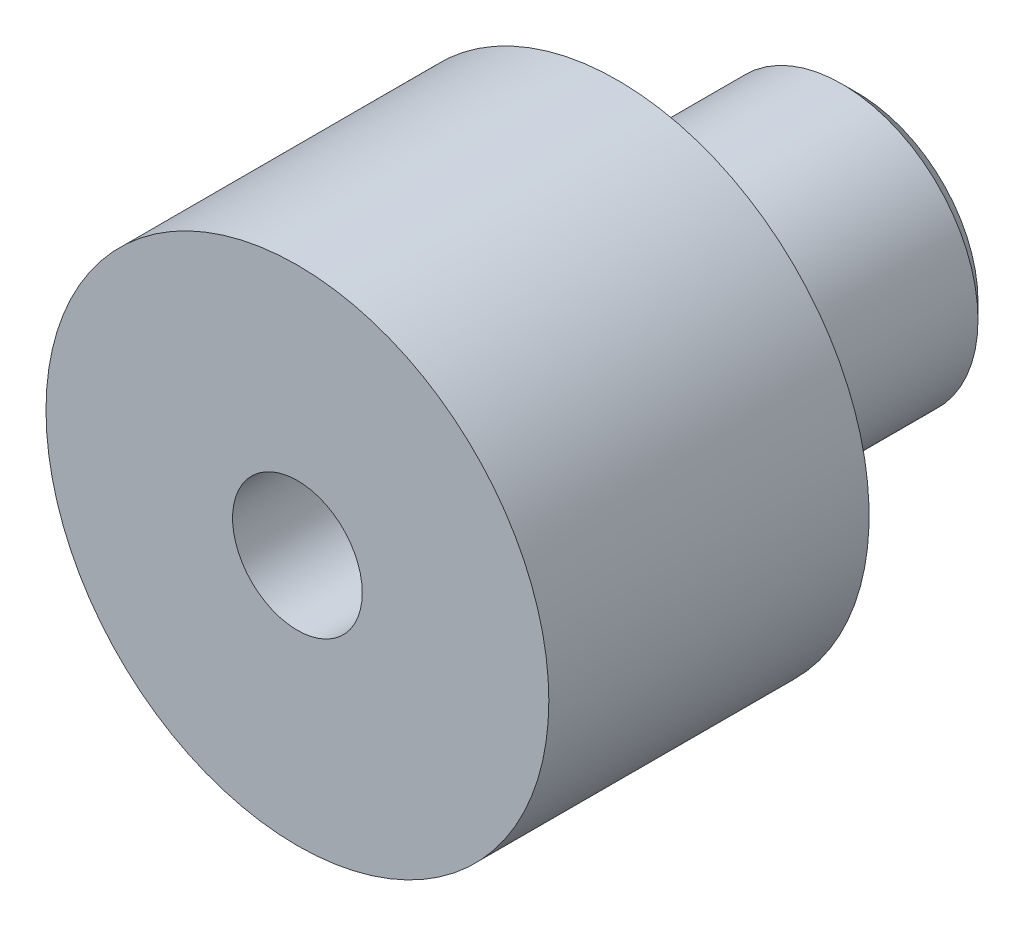
ISO-10303-21;
HEADER;
FILE_DESCRIPTION(('STEP AP214'),'2;1');
FILE_NAME('part.step','',(''),(''),'','','');
FILE_SCHEMA(('AUTOMOTIVE_DESIGN { 1 0 10303 214 1 1 1 1 }'));
ENDSEC;
DATA;
#1=APPLICATION_CONTEXT('core data for automotive mechanical design processes');
#2=APPLICATION_PROTOCOL_DEFINITION('international standard','automotive_design',2000,#1);
#3=PRODUCT_CONTEXT('',#1,'mechanical');
#4=PRODUCT('Part','Part','',(#3));
#5=PRODUCT_RELATED_PRODUCT_CATEGORY('part','',(#4));
#6=PRODUCT_DEFINITION_FORMATION('','',#4);
#7=PRODUCT_DEFINITION_CONTEXT('part definition',#1,'design');
#8=PRODUCT_DEFINITION('design','',#6,#7);
#9=PRODUCT_DEFINITION_SHAPE('','',#8);
#10=(LENGTH_UNIT() NAMED_UNIT(*) SI_UNIT(.MILLI.,.METRE.));
#11=(NAMED_UNIT(*) PLANE_ANGLE_UNIT() SI_UNIT($,.RADIAN.));
#12=(NAMED_UNIT(*) SI_UNIT($,.STERADIAN.) SOLID_ANGLE_UNIT());
#13=UNCERTAINTY_MEASURE_WITH_UNIT(LENGTH_MEASURE(1.E-05),#10,'distance_accuracy_value','');
#14=(GEOMETRIC_REPRESENTATION_CONTEXT(3) GLOBAL_UNCERTAINTY_ASSIGNED_CONTEXT((#13)) GLOBAL_UNIT_ASSIGNED_CONTEXT((#10,
#11,#12)) REPRESENTATION_CONTEXT('',''));
#15=CARTESIAN_POINT('',(0.,0.,0.));
#16=DIRECTION('',(0.,0.,1.));
#17=DIRECTION('',(1.,0.,0.));
#18=AXIS2_PLACEMENT_3D('',#15,#16,#17);
#19=CARTESIAN_POINT('',(0.,0.,30.));
#20=DIRECTION('',(0.,0.,1.));
#21=DIRECTION('',(1.,0.,0.));
#22=AXIS2_PLACEMENT_3D('',#19,#20,#21);
#23=PLANE('',#22);
#24=CARTESIAN_POINT('',(0.,0.,30.));
#25=DIRECTION('',(0.,0.,1.));
#26=DIRECTION('',(1.,0.,0.));
#27=AXIS2_PLACEMENT_3D('',#24,#25,#26);
#28=CIRCLE('',#27,9.5);
#29=CARTESIAN_POINT('',(9.5,0.,30.));
#30=VERTEX_POINT('',#29);
#31=EDGE_CURVE('E94',#30,#30,#28,.T.);
#32=ORIENTED_EDGE('',*,*,#31,.T.);
#33=EDGE_LOOP('',(#32));
#34=FACE_BOUND('',#33,.T.);
#35=CARTESIAN_POINT('',(0.,0.,30.));
#36=DIRECTION('',(0.,0.,1.));
#37=DIRECTION('',(1.,0.,0.));
#38=AXIS2_PLACEMENT_3D('',#35,#36,#37);
#39=CIRCLE('',#38,9.7);
#40=CARTESIAN_POINT('',(9.7,0.,30.));
#41=VERTEX_POINT('',#40);
#42=EDGE_CURVE('E98',#41,#41,#39,.F.);
#43=ORIENTED_EDGE('',*,*,#42,.T.);
#44=EDGE_LOOP('',(#43));
#45=FACE_BOUND('',#44,.T.);
#46=ADVANCED_FACE('F53',(#34,#45),#23,.F.);
#47=CARTESIAN_POINT('',(0.,0.,0.));
#48=DIRECTION('',(0.,0.,1.));
#49=DIRECTION('',(1.,0.,0.));
#50=AXIS2_PLACEMENT_3D('',#47,#48,#49);
#51=PLANE('',#50);
#52=CARTESIAN_POINT('',(0.,0.,0.));
#53=DIRECTION('',(0.,0.,1.));
#54=DIRECTION('',(1.,0.,0.));
#55=AXIS2_PLACEMENT_3D('',#52,#53,#54);
#56=CIRCLE('',#55,7.5);
#57=CARTESIAN_POINT('',(7.5,0.,0.));
#58=VERTEX_POINT('',#57);
#59=EDGE_CURVE('E62',#58,#58,#56,.F.);
#60=ORIENTED_EDGE('',*,*,#59,.T.);
#61=EDGE_LOOP('',(#60));
#62=FACE_BOUND('',#61,.T.);
#63=CARTESIAN_POINT('',(0.,0.,0.));
#64=DIRECTION('',(0.,0.,1.));
#65=DIRECTION('',(1.,0.,0.));
#66=AXIS2_PLACEMENT_3D('',#63,#64,#65);
#67=CIRCLE('',#66,5.05000000000001);
#68=CARTESIAN_POINT('',(5.05000000000001,0.,0.));
#69=VERTEX_POINT('',#68);
#70=EDGE_CURVE('E67',#69,#69,#67,.T.);
#71=ORIENTED_EDGE('',*,*,#70,.T.);
#72=EDGE_LOOP('',(#71));
#73=FACE_BOUND('',#72,.T.);
#74=ADVANCED_FACE('F134',(#62,#73),#51,.F.);
#75=CARTESIAN_POINT('',(0.,0.,30.));
#76=DIRECTION('',(0.,0.,-1.));
#77=DIRECTION('',(-1.,0.,0.));
#78=AXIS2_PLACEMENT_3D('',#75,#76,#77);
#79=CYLINDRICAL_SURFACE('',#78,8.5);
#80=CARTESIAN_POINT('',(0.,0.,1.));
#81=DIRECTION('',(0.,0.,1.));
#82=DIRECTION('',(1.,0.,0.));
#83=AXIS2_PLACEMENT_3D('',#80,#81,#82);
#84=CIRCLE('',#83,8.5);
#85=CARTESIAN_POINT('',(8.5,0.,1.));
#86=VERTEX_POINT('',#85);
#87=EDGE_CURVE('E72',#86,#86,#84,.T.);
#88=ORIENTED_EDGE('',*,*,#87,.T.);
#89=EDGE_LOOP('',(#88));
#90=FACE_BOUND('',#89,.T.);
#91=CARTESIAN_POINT('',(0.,0.,29.));
#92=DIRECTION('',(0.,0.,1.));
#93=DIRECTION('',(1.,0.,0.));
#94=AXIS2_PLACEMENT_3D('',#91,#92,#93);
#95=CIRCLE('',#94,8.5);
#96=CARTESIAN_POINT('',(8.5,0.,29.));
#97=VERTEX_POINT('',#96);
#98=EDGE_CURVE('E90',#97,#97,#95,.F.);
#99=ORIENTED_EDGE('',*,*,#98,.T.);
#100=EDGE_LOOP('',(#99));
#101=FACE_BOUND('',#100,.T.);
#102=ADVANCED_FACE('F129',(#90,#101),#79,.T.);
#103=CARTESIAN_POINT('',(0.,0.,30.));
#104=DIRECTION('',(0.,0.,-1.));
#105=DIRECTION('',(-1.,0.,0.));
#106=AXIS2_PLACEMENT_3D('',#103,#104,#105);
#107=CYLINDRICAL_SURFACE('',#106,4.05);
#108=CARTESIAN_POINT('',(0.,0.,1.00000000000001));
#109=DIRECTION('',(0.,0.,1.));
#110=DIRECTION('',(1.,0.,0.));
#111=AXIS2_PLACEMENT_3D('',#108,#109,#110);
#112=CIRCLE('',#111,4.05);
#113=CARTESIAN_POINT('',(4.05,0.,1.00000000000001));
#114=VERTEX_POINT('',#113);
#115=EDGE_CURVE('E11',#114,#114,#112,.F.);
#116=ORIENTED_EDGE('',*,*,#115,.T.);
#117=EDGE_LOOP('',(#116));
#118=FACE_BOUND('',#117,.T.);
#119=CARTESIAN_POINT('',(0.,0.,35.));
#120=DIRECTION('',(0.,0.,1.));
#121=DIRECTION('',(1.,0.,0.));
#122=AXIS2_PLACEMENT_3D('',#119,#120,#121);
#123=CIRCLE('',#122,4.05);
#124=CARTESIAN_POINT('',(4.05,0.,35.));
#125=VERTEX_POINT('',#124);
#126=EDGE_CURVE('E102',#125,#125,#123,.F.);
#127=ORIENTED_EDGE('',*,*,#126,.F.);
#128=EDGE_LOOP('',(#127));
#129=FACE_BOUND('',#128,.T.);
#130=ADVANCED_FACE('F120',(#118,#129),#107,.F.);
#131=CARTESIAN_POINT('',(0.,0.,35.));
#132=DIRECTION('',(0.,0.,-1.));
#133=DIRECTION('',(-1.,0.,0.));
#134=AXIS2_PLACEMENT_3D('',#131,#132,#133);
#135=CYLINDRICAL_SURFACE('',#134,15.7);
#136=CARTESIAN_POINT('',(0.,0.,35.));
#137=DIRECTION('',(0.,0.,1.));
#138=DIRECTION('',(1.,0.,0.));
#139=AXIS2_PLACEMENT_3D('',#136,#137,#138);
#140=CIRCLE('',#139,15.7);
#141=CARTESIAN_POINT('',(15.7,0.,35.));
#142=VERTEX_POINT('',#141);
#143=EDGE_CURVE('E106',#142,#142,#140,.T.);
#144=ORIENTED_EDGE('',*,*,#143,.F.);
#145=EDGE_LOOP('',(#144));
#146=FACE_BOUND('',#145,.T.);
#147=CARTESIAN_POINT('',(0.,0.,15.));
#148=DIRECTION('',(0.,0.,-1.));
#149=DIRECTION('',(-1.,0.,0.));
#150=AXIS2_PLACEMENT_3D('',#147,#148,#149);
#151=CIRCLE('',#150,15.7);
#152=CARTESIAN_POINT('',(-15.7,0.,15.));
#153=VERTEX_POINT('',#152);
#154=EDGE_CURVE('E110',#153,#153,#151,.T.);
#155=ORIENTED_EDGE('',*,*,#154,.F.);
#156=EDGE_LOOP('',(#155));
#157=FACE_BOUND('',#156,.T.);
#158=ADVANCED_FACE('F117',(#146,#157),#135,.T.);
#159=CARTESIAN_POINT('',(0.,0.,35.));
#160=DIRECTION('',(0.,0.,1.));
#161=DIRECTION('',(1.,0.,0.));
#162=AXIS2_PLACEMENT_3D('',#159,#160,#161);
#163=PLANE('',#162);
#164=ORIENTED_EDGE('',*,*,#143,.T.);
#165=EDGE_LOOP('',(#164));
#166=FACE_BOUND('',#165,.T.);
#167=ORIENTED_EDGE('',*,*,#126,.T.);
#168=EDGE_LOOP('',(#167));
#169=FACE_BOUND('',#168,.T.);
#170=ADVANCED_FACE('F119',(#166,#169),#163,.T.);
#171=CARTESIAN_POINT('',(0.,0.,15.));
#172=DIRECTION('',(0.,0.,-1.));
#173=DIRECTION('',(-1.,0.,0.));
#174=AXIS2_PLACEMENT_3D('',#171,#172,#173);
#175=PLANE('',#174);
#176=CARTESIAN_POINT('',(0.,0.,15.));
#177=DIRECTION('',(0.,0.,-1.));
#178=DIRECTION('',(-1.,0.,0.));
#179=AXIS2_PLACEMENT_3D('',#176,#177,#178);
#180=CIRCLE('',#179,11.7);
#181=CARTESIAN_POINT('',(-11.7,0.,15.));
#182=VERTEX_POINT('',#181);
#183=EDGE_CURVE('E78',#182,#182,#180,.F.);
#184=ORIENTED_EDGE('',*,*,#183,.T.);
#185=EDGE_LOOP('',(#184));
#186=FACE_BOUND('',#185,.T.);
#187=ORIENTED_EDGE('',*,*,#154,.T.);
#188=EDGE_LOOP('',(#187));
#189=FACE_BOUND('',#188,.T.);
#190=ADVANCED_FACE('F115',(#186,#189),#175,.T.);
#191=CARTESIAN_POINT('',(0.,0.,15.));
#192=DIRECTION('',(0.,0.,1.));
#193=DIRECTION('',(1.,0.,0.));
#194=AXIS2_PLACEMENT_3D('',#191,#192,#193);
#195=CYLINDRICAL_SURFACE('',#194,10.7);
#196=CARTESIAN_POINT('',(0.,0.,16.));
#197=DIRECTION('',(0.,0.,-1.));
#198=DIRECTION('',(-1.,0.,0.));
#199=AXIS2_PLACEMENT_3D('',#196,#197,#198);
#200=CIRCLE('',#199,10.7);
#201=CARTESIAN_POINT('',(-10.7,0.,16.));
#202=VERTEX_POINT('',#201);
#203=EDGE_CURVE('E82',#202,#202,#200,.T.);
#204=ORIENTED_EDGE('',*,*,#203,.T.);
#205=EDGE_LOOP('',(#204));
#206=FACE_BOUND('',#205,.T.);
#207=CARTESIAN_POINT('',(0.,0.,29.));
#208=DIRECTION('',(0.,0.,1.));
#209=DIRECTION('',(1.,0.,0.));
#210=AXIS2_PLACEMENT_3D('',#207,#208,#209);
#211=CIRCLE('',#210,10.7);
#212=CARTESIAN_POINT('',(10.7,0.,29.));
#213=VERTEX_POINT('',#212);
#214=EDGE_CURVE('E86',#213,#213,#211,.T.);
#215=ORIENTED_EDGE('',*,*,#214,.T.);
#216=EDGE_LOOP('',(#215));
#217=FACE_BOUND('',#216,.T.);
#218=ADVANCED_FACE('F144',(#206,#217),#195,.F.);
#219=CARTESIAN_POINT('',(0.,0.,29.));
#220=DIRECTION('',(0.,0.,1.));
#221=DIRECTION('',(1.,0.,0.));
#222=AXIS2_PLACEMENT_3D('',#219,#220,#221);
#223=TOROIDAL_SURFACE('',#222,9.5,1.);
#224=ORIENTED_EDGE('',*,*,#98,.F.);
#225=EDGE_LOOP('',(#224));
#226=FACE_BOUND('',#225,.T.);
#227=ORIENTED_EDGE('',*,*,#31,.F.);
#228=EDGE_LOOP('',(#227));
#229=FACE_BOUND('',#228,.T.);
#230=ADVANCED_FACE('F147',(#226,#229),#223,.F.);
#231=CARTESIAN_POINT('',(0.,0.,29.));
#232=DIRECTION('',(0.,0.,1.));
#233=DIRECTION('',(1.,0.,0.));
#234=AXIS2_PLACEMENT_3D('',#231,#232,#233);
#235=TOROIDAL_SURFACE('',#234,9.7,1.);
#236=ORIENTED_EDGE('',*,*,#214,.F.);
#237=EDGE_LOOP('',(#236));
#238=FACE_BOUND('',#237,.T.);
#239=ORIENTED_EDGE('',*,*,#42,.F.);
#240=EDGE_LOOP('',(#239));
#241=FACE_BOUND('',#240,.T.);
#242=ADVANCED_FACE('F152',(#238,#241),#235,.F.);
#243=CARTESIAN_POINT('',(0.,0.,16.));
#244=DIRECTION('',(0.,0.,-1.));
#245=DIRECTION('',(-1.,0.,0.));
#246=AXIS2_PLACEMENT_3D('',#243,#244,#245);
#247=CONICAL_SURFACE('',#246,10.7,0.785398163397451);
#248=ORIENTED_EDGE('',*,*,#183,.F.);
#249=EDGE_LOOP('',(#248));
#250=FACE_BOUND('',#249,.T.);
#251=ORIENTED_EDGE('',*,*,#203,.F.);
#252=EDGE_LOOP('',(#251));
#253=FACE_BOUND('',#252,.T.);
#254=ADVANCED_FACE('F161',(#250,#253),#247,.F.);
#255=CARTESIAN_POINT('',(0.,0.,1.));
#256=DIRECTION('',(0.,0.,1.));
#257=DIRECTION('',(1.,0.,0.));
#258=AXIS2_PLACEMENT_3D('',#255,#256,#257);
#259=CONICAL_SURFACE('',#258,8.5,0.785398163397448);
#260=ORIENTED_EDGE('',*,*,#59,.F.);
#261=EDGE_LOOP('',(#260));
#262=FACE_BOUND('',#261,.T.);
#263=ORIENTED_EDGE('',*,*,#87,.F.);
#264=EDGE_LOOP('',(#263));
#265=FACE_BOUND('',#264,.T.);
#266=ADVANCED_FACE('F167',(#262,#265),#259,.T.);
#267=CARTESIAN_POINT('',(0.,0.,0.));
#268=DIRECTION('',(0.,0.,-1.));
#269=DIRECTION('',(-1.,0.,0.));
#270=AXIS2_PLACEMENT_3D('',#267,#268,#269);
#271=CONICAL_SURFACE('',#270,5.05000000000001,0.785398163397447);
#272=ORIENTED_EDGE('',*,*,#115,.F.);
#273=EDGE_LOOP('',(#272));
#274=FACE_BOUND('',#273,.T.);
#275=ORIENTED_EDGE('',*,*,#70,.F.);
#276=EDGE_LOOP('',(#275));
#277=FACE_BOUND('',#276,.T.);
#278=ADVANCED_FACE('F56',(#274,#277),#271,.F.);
#279=CLOSED_SHELL('',(#46,#74,#102,#130,#158,#170,#190,#218,#230,#242,#254,#266,#278));
#280=MANIFOLD_SOLID_BREP('B2',#279);
#281=ADVANCED_BREP_SHAPE_REPRESENTATION('',(#18,#280),#14);
#282=SHAPE_DEFINITION_REPRESENTATION(#9,#281);
ENDSEC;
END-ISO-10303-21;
